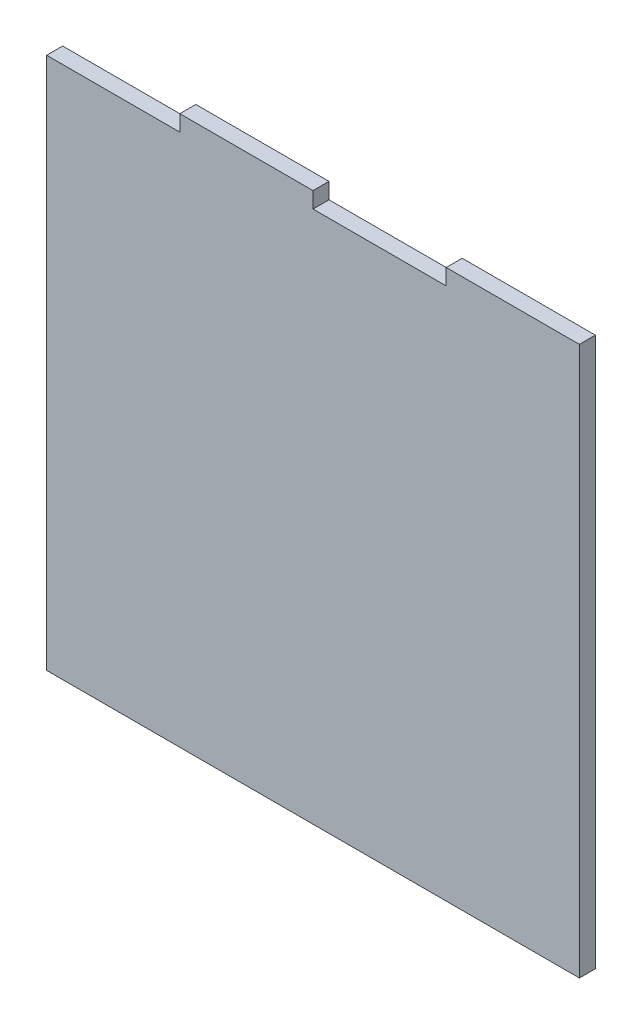
ISO-10303-21;
HEADER;
FILE_DESCRIPTION(('STEP AP214'),'2;1');
FILE_NAME('part.step','',(''),(''),'','','');
FILE_SCHEMA(('AUTOMOTIVE_DESIGN { 1 0 10303 214 1 1 1 1 }'));
ENDSEC;
DATA;
#1=APPLICATION_CONTEXT('core data for automotive mechanical design processes');
#2=APPLICATION_PROTOCOL_DEFINITION('international standard','automotive_design',2000,#1);
#3=PRODUCT_CONTEXT('',#1,'mechanical');
#4=PRODUCT('Part','Part','',(#3));
#5=PRODUCT_RELATED_PRODUCT_CATEGORY('part','',(#4));
#6=PRODUCT_DEFINITION_FORMATION('','',#4);
#7=PRODUCT_DEFINITION_CONTEXT('part definition',#1,'design');
#8=PRODUCT_DEFINITION('design','',#6,#7);
#9=PRODUCT_DEFINITION_SHAPE('','',#8);
#10=(LENGTH_UNIT() NAMED_UNIT(*) SI_UNIT(.MILLI.,.METRE.));
#11=(NAMED_UNIT(*) PLANE_ANGLE_UNIT() SI_UNIT($,.RADIAN.));
#12=(NAMED_UNIT(*) SI_UNIT($,.STERADIAN.) SOLID_ANGLE_UNIT());
#13=UNCERTAINTY_MEASURE_WITH_UNIT(LENGTH_MEASURE(1.E-05),#10,'distance_accuracy_value','');
#14=(GEOMETRIC_REPRESENTATION_CONTEXT(3) GLOBAL_UNCERTAINTY_ASSIGNED_CONTEXT((#13)) GLOBAL_UNIT_ASSIGNED_CONTEXT((#10,
#11,#12)) REPRESENTATION_CONTEXT('',''));
#15=CARTESIAN_POINT('',(0.,0.,0.));
#16=DIRECTION('',(0.,0.,1.));
#17=DIRECTION('',(1.,0.,0.));
#18=AXIS2_PLACEMENT_3D('',#15,#16,#17);
#19=CARTESIAN_POINT('',(0.,0.,6.));
#20=DIRECTION('',(1.,0.,0.));
#21=DIRECTION('',(0.,1.,0.));
#22=AXIS2_PLACEMENT_3D('',#19,#20,#21);
#23=PLANE('',#22);
#24=DIRECTION('',(0.,-1.,0.));
#25=VECTOR('',#24,1.);
#26=CARTESIAN_POINT('',(0.,0.,0.));
#27=LINE('',#26,#25);
#28=CARTESIAN_POINT('',(0.,0.,0.));
#29=VERTEX_POINT('',#28);
#30=CARTESIAN_POINT('',(0.,-200.,0.));
#31=VERTEX_POINT('',#30);
#32=EDGE_CURVE('E142',#29,#31,#27,.T.);
#33=ORIENTED_EDGE('',*,*,#32,.T.);
#34=DIRECTION('',(0.,0.,-1.));
#35=VECTOR('',#34,1.);
#36=CARTESIAN_POINT('',(0.,-200.,6.));
#37=LINE('',#36,#35);
#38=CARTESIAN_POINT('',(0.,-200.,6.));
#39=VERTEX_POINT('',#38);
#40=EDGE_CURVE('E11',#39,#31,#37,.T.);
#41=ORIENTED_EDGE('',*,*,#40,.F.);
#42=DIRECTION('',(0.,-1.,0.));
#43=VECTOR('',#42,1.);
#44=CARTESIAN_POINT('',(0.,0.,6.));
#45=LINE('',#44,#43);
#46=CARTESIAN_POINT('',(0.,0.,6.));
#47=VERTEX_POINT('',#46);
#48=EDGE_CURVE('E161',#47,#39,#45,.T.);
#49=ORIENTED_EDGE('',*,*,#48,.F.);
#50=DIRECTION('',(0.,0.,-1.));
#51=VECTOR('',#50,1.);
#52=CARTESIAN_POINT('',(0.,0.,6.));
#53=LINE('',#52,#51);
#54=EDGE_CURVE('E138',#47,#29,#53,.T.);
#55=ORIENTED_EDGE('',*,*,#54,.T.);
#56=EDGE_LOOP('',(#33,#41,#49,#55));
#57=FACE_BOUND('',#56,.T.);
#58=ADVANCED_FACE('F34',(#57),#23,.F.);
#59=CARTESIAN_POINT('',(0.,-200.,6.));
#60=DIRECTION('',(0.,1.,0.));
#61=DIRECTION('',(0.,0.,1.));
#62=AXIS2_PLACEMENT_3D('',#59,#60,#61);
#63=PLANE('',#62);
#64=DIRECTION('',(1.,0.,0.));
#65=VECTOR('',#64,1.);
#66=CARTESIAN_POINT('',(0.,-200.,0.));
#67=LINE('',#66,#65);
#68=CARTESIAN_POINT('',(200.,-200.,0.));
#69=VERTEX_POINT('',#68);
#70=EDGE_CURVE('E145',#31,#69,#67,.T.);
#71=ORIENTED_EDGE('',*,*,#70,.T.);
#72=DIRECTION('',(0.,0.,-1.));
#73=VECTOR('',#72,1.);
#74=CARTESIAN_POINT('',(200.,-200.,6.));
#75=LINE('',#74,#73);
#76=CARTESIAN_POINT('',(200.,-200.,6.));
#77=VERTEX_POINT('',#76);
#78=EDGE_CURVE('E42',#77,#69,#75,.T.);
#79=ORIENTED_EDGE('',*,*,#78,.F.);
#80=DIRECTION('',(1.,0.,0.));
#81=VECTOR('',#80,1.);
#82=CARTESIAN_POINT('',(0.,-200.,6.));
#83=LINE('',#82,#81);
#84=EDGE_CURVE('E99',#39,#77,#83,.T.);
#85=ORIENTED_EDGE('',*,*,#84,.F.);
#86=ORIENTED_EDGE('',*,*,#40,.T.);
#87=EDGE_LOOP('',(#71,#79,#85,#86));
#88=FACE_BOUND('',#87,.T.);
#89=ADVANCED_FACE('F182',(#88),#63,.F.);
#90=CARTESIAN_POINT('',(200.,6.,6.));
#91=DIRECTION('',(-1.,0.,0.));
#92=DIRECTION('',(0.,0.,1.));
#93=AXIS2_PLACEMENT_3D('',#90,#91,#92);
#94=PLANE('',#93);
#95=DIRECTION('',(0.,1.,0.));
#96=VECTOR('',#95,1.);
#97=CARTESIAN_POINT('',(200.,6.,0.));
#98=LINE('',#97,#96);
#99=CARTESIAN_POINT('',(200.,6.,0.));
#100=VERTEX_POINT('',#99);
#101=EDGE_CURVE('E148',#69,#100,#98,.T.);
#102=ORIENTED_EDGE('',*,*,#101,.T.);
#103=DIRECTION('',(0.,0.,-1.));
#104=VECTOR('',#103,1.);
#105=CARTESIAN_POINT('',(200.,6.,6.));
#106=LINE('',#105,#104);
#107=CARTESIAN_POINT('',(200.,6.,6.));
#108=VERTEX_POINT('',#107);
#109=EDGE_CURVE('E174',#108,#100,#106,.T.);
#110=ORIENTED_EDGE('',*,*,#109,.F.);
#111=DIRECTION('',(0.,1.,0.));
#112=VECTOR('',#111,1.);
#113=CARTESIAN_POINT('',(200.,0.,6.));
#114=LINE('',#113,#112);
#115=EDGE_CURVE('E181',#77,#108,#114,.T.);
#116=ORIENTED_EDGE('',*,*,#115,.F.);
#117=ORIENTED_EDGE('',*,*,#78,.T.);
#118=EDGE_LOOP('',(#102,#110,#116,#117));
#119=FACE_BOUND('',#118,.T.);
#120=ADVANCED_FACE('F179',(#119),#94,.F.);
#121=CARTESIAN_POINT('',(150.,6.,6.));
#122=DIRECTION('',(0.,-1.,0.));
#123=DIRECTION('',(0.,0.,-1.));
#124=AXIS2_PLACEMENT_3D('',#121,#122,#123);
#125=PLANE('',#124);
#126=DIRECTION('',(-1.,0.,0.));
#127=VECTOR('',#126,1.);
#128=CARTESIAN_POINT('',(150.,6.,0.));
#129=LINE('',#128,#127);
#130=CARTESIAN_POINT('',(150.,6.,0.));
#131=VERTEX_POINT('',#130);
#132=EDGE_CURVE('E150',#100,#131,#129,.T.);
#133=ORIENTED_EDGE('',*,*,#132,.T.);
#134=DIRECTION('',(0.,0.,-1.));
#135=VECTOR('',#134,1.);
#136=CARTESIAN_POINT('',(150.,6.,6.));
#137=LINE('',#136,#135);
#138=CARTESIAN_POINT('',(150.,6.,6.));
#139=VERTEX_POINT('',#138);
#140=EDGE_CURVE('E171',#139,#131,#137,.T.);
#141=ORIENTED_EDGE('',*,*,#140,.F.);
#142=DIRECTION('',(-1.,0.,0.));
#143=VECTOR('',#142,1.);
#144=CARTESIAN_POINT('',(150.,6.,6.));
#145=LINE('',#144,#143);
#146=EDGE_CURVE('E201',#108,#139,#145,.T.);
#147=ORIENTED_EDGE('',*,*,#146,.F.);
#148=ORIENTED_EDGE('',*,*,#109,.T.);
#149=EDGE_LOOP('',(#133,#141,#147,#148));
#150=FACE_BOUND('',#149,.T.);
#151=ADVANCED_FACE('F192',(#150),#125,.F.);
#152=CARTESIAN_POINT('',(150.,0.,6.));
#153=DIRECTION('',(1.,0.,0.));
#154=DIRECTION('',(0.,0.,-1.));
#155=AXIS2_PLACEMENT_3D('',#152,#153,#154);
#156=PLANE('',#155);
#157=DIRECTION('',(0.,-1.,0.));
#158=VECTOR('',#157,1.);
#159=CARTESIAN_POINT('',(150.,0.,0.));
#160=LINE('',#159,#158);
#161=CARTESIAN_POINT('',(150.,0.,0.));
#162=VERTEX_POINT('',#161);
#163=EDGE_CURVE('E152',#131,#162,#160,.T.);
#164=ORIENTED_EDGE('',*,*,#163,.T.);
#165=DIRECTION('',(0.,0.,-1.));
#166=VECTOR('',#165,1.);
#167=CARTESIAN_POINT('',(150.,0.,6.));
#168=LINE('',#167,#166);
#169=CARTESIAN_POINT('',(150.,0.,6.));
#170=VERTEX_POINT('',#169);
#171=EDGE_CURVE('E168',#170,#162,#168,.T.);
#172=ORIENTED_EDGE('',*,*,#171,.F.);
#173=DIRECTION('',(0.,-1.,0.));
#174=VECTOR('',#173,1.);
#175=CARTESIAN_POINT('',(150.,0.,6.));
#176=LINE('',#175,#174);
#177=EDGE_CURVE('E198',#139,#170,#176,.T.);
#178=ORIENTED_EDGE('',*,*,#177,.F.);
#179=ORIENTED_EDGE('',*,*,#140,.T.);
#180=EDGE_LOOP('',(#164,#172,#178,#179));
#181=FACE_BOUND('',#180,.T.);
#182=ADVANCED_FACE('F196',(#181),#156,.F.);
#183=CARTESIAN_POINT('',(100.,0.,6.));
#184=DIRECTION('',(0.,-1.,0.));
#185=DIRECTION('',(0.,0.,-1.));
#186=AXIS2_PLACEMENT_3D('',#183,#184,#185);
#187=PLANE('',#186);
#188=DIRECTION('',(-1.,0.,0.));
#189=VECTOR('',#188,1.);
#190=CARTESIAN_POINT('',(100.,0.,0.));
#191=LINE('',#190,#189);
#192=CARTESIAN_POINT('',(100.,0.,0.));
#193=VERTEX_POINT('',#192);
#194=EDGE_CURVE('E154',#162,#193,#191,.T.);
#195=ORIENTED_EDGE('',*,*,#194,.T.);
#196=DIRECTION('',(0.,0.,-1.));
#197=VECTOR('',#196,1.);
#198=CARTESIAN_POINT('',(100.,0.,6.));
#199=LINE('',#198,#197);
#200=CARTESIAN_POINT('',(100.,0.,6.));
#201=VERTEX_POINT('',#200);
#202=EDGE_CURVE('E165',#201,#193,#199,.T.);
#203=ORIENTED_EDGE('',*,*,#202,.F.);
#204=DIRECTION('',(-1.,0.,0.));
#205=VECTOR('',#204,1.);
#206=CARTESIAN_POINT('',(100.,0.,6.));
#207=LINE('',#206,#205);
#208=EDGE_CURVE('E200',#170,#201,#207,.T.);
#209=ORIENTED_EDGE('',*,*,#208,.F.);
#210=ORIENTED_EDGE('',*,*,#171,.T.);
#211=EDGE_LOOP('',(#195,#203,#209,#210));
#212=FACE_BOUND('',#211,.T.);
#213=ADVANCED_FACE('F216',(#212),#187,.F.);
#214=CARTESIAN_POINT('',(100.,6.,6.));
#215=DIRECTION('',(-1.,0.,0.));
#216=DIRECTION('',(0.,0.,1.));
#217=AXIS2_PLACEMENT_3D('',#214,#215,#216);
#218=PLANE('',#217);
#219=DIRECTION('',(0.,1.,0.));
#220=VECTOR('',#219,1.);
#221=CARTESIAN_POINT('',(100.,6.,0.));
#222=LINE('',#221,#220);
#223=CARTESIAN_POINT('',(100.,6.,0.));
#224=VERTEX_POINT('',#223);
#225=EDGE_CURVE('E156',#193,#224,#222,.T.);
#226=ORIENTED_EDGE('',*,*,#225,.T.);
#227=DIRECTION('',(0.,0.,-1.));
#228=VECTOR('',#227,1.);
#229=CARTESIAN_POINT('',(100.,6.,6.));
#230=LINE('',#229,#228);
#231=CARTESIAN_POINT('',(100.,6.,6.));
#232=VERTEX_POINT('',#231);
#233=EDGE_CURVE('E133',#232,#224,#230,.T.);
#234=ORIENTED_EDGE('',*,*,#233,.F.);
#235=DIRECTION('',(0.,1.,0.));
#236=VECTOR('',#235,1.);
#237=CARTESIAN_POINT('',(100.,6.,6.));
#238=LINE('',#237,#236);
#239=EDGE_CURVE('E124',#201,#232,#238,.T.);
#240=ORIENTED_EDGE('',*,*,#239,.F.);
#241=ORIENTED_EDGE('',*,*,#202,.T.);
#242=EDGE_LOOP('',(#226,#234,#240,#241));
#243=FACE_BOUND('',#242,.T.);
#244=ADVANCED_FACE('F213',(#243),#218,.F.);
#245=CARTESIAN_POINT('',(50.,6.,6.));
#246=DIRECTION('',(0.,-1.,0.));
#247=DIRECTION('',(0.,0.,-1.));
#248=AXIS2_PLACEMENT_3D('',#245,#246,#247);
#249=PLANE('',#248);
#250=DIRECTION('',(-1.,0.,0.));
#251=VECTOR('',#250,1.);
#252=CARTESIAN_POINT('',(50.,6.,0.));
#253=LINE('',#252,#251);
#254=CARTESIAN_POINT('',(50.,6.,0.));
#255=VERTEX_POINT('',#254);
#256=EDGE_CURVE('E132',#224,#255,#253,.T.);
#257=ORIENTED_EDGE('',*,*,#256,.T.);
#258=DIRECTION('',(0.,0.,-1.));
#259=VECTOR('',#258,1.);
#260=CARTESIAN_POINT('',(50.,6.,6.));
#261=LINE('',#260,#259);
#262=CARTESIAN_POINT('',(50.,6.,6.));
#263=VERTEX_POINT('',#262);
#264=EDGE_CURVE('E129',#263,#255,#261,.T.);
#265=ORIENTED_EDGE('',*,*,#264,.F.);
#266=DIRECTION('',(-1.,0.,0.));
#267=VECTOR('',#266,1.);
#268=CARTESIAN_POINT('',(50.,6.,6.));
#269=LINE('',#268,#267);
#270=EDGE_CURVE('E118',#232,#263,#269,.T.);
#271=ORIENTED_EDGE('',*,*,#270,.F.);
#272=ORIENTED_EDGE('',*,*,#233,.T.);
#273=EDGE_LOOP('',(#257,#265,#271,#272));
#274=FACE_BOUND('',#273,.T.);
#275=ADVANCED_FACE('F130',(#274),#249,.F.);
#276=CARTESIAN_POINT('',(50.,0.,6.));
#277=DIRECTION('',(1.,0.,0.));
#278=DIRECTION('',(0.,0.,-1.));
#279=AXIS2_PLACEMENT_3D('',#276,#277,#278);
#280=PLANE('',#279);
#281=DIRECTION('',(0.,-1.,0.));
#282=VECTOR('',#281,1.);
#283=CARTESIAN_POINT('',(50.,0.,0.));
#284=LINE('',#283,#282);
#285=CARTESIAN_POINT('',(50.,0.,0.));
#286=VERTEX_POINT('',#285);
#287=EDGE_CURVE('E85',#255,#286,#284,.T.);
#288=ORIENTED_EDGE('',*,*,#287,.T.);
#289=DIRECTION('',(0.,0.,-1.));
#290=VECTOR('',#289,1.);
#291=CARTESIAN_POINT('',(50.,0.,6.));
#292=LINE('',#291,#290);
#293=CARTESIAN_POINT('',(50.,0.,6.));
#294=VERTEX_POINT('',#293);
#295=EDGE_CURVE('E134',#294,#286,#292,.T.);
#296=ORIENTED_EDGE('',*,*,#295,.F.);
#297=DIRECTION('',(0.,-1.,0.));
#298=VECTOR('',#297,1.);
#299=CARTESIAN_POINT('',(50.,0.,6.));
#300=LINE('',#299,#298);
#301=EDGE_CURVE('E122',#263,#294,#300,.T.);
#302=ORIENTED_EDGE('',*,*,#301,.F.);
#303=ORIENTED_EDGE('',*,*,#264,.T.);
#304=EDGE_LOOP('',(#288,#296,#302,#303));
#305=FACE_BOUND('',#304,.T.);
#306=ADVANCED_FACE('F136',(#305),#280,.F.);
#307=CARTESIAN_POINT('',(0.,0.,6.));
#308=DIRECTION('',(0.,-1.,0.));
#309=DIRECTION('',(0.,0.,-1.));
#310=AXIS2_PLACEMENT_3D('',#307,#308,#309);
#311=PLANE('',#310);
#312=DIRECTION('',(-1.,0.,0.));
#313=VECTOR('',#312,1.);
#314=CARTESIAN_POINT('',(0.,0.,0.));
#315=LINE('',#314,#313);
#316=EDGE_CURVE('E91',#286,#29,#315,.T.);
#317=ORIENTED_EDGE('',*,*,#316,.T.);
#318=ORIENTED_EDGE('',*,*,#54,.F.);
#319=DIRECTION('',(-1.,0.,0.));
#320=VECTOR('',#319,1.);
#321=CARTESIAN_POINT('',(0.,0.,6.));
#322=LINE('',#321,#320);
#323=EDGE_CURVE('E50',#294,#47,#322,.T.);
#324=ORIENTED_EDGE('',*,*,#323,.F.);
#325=ORIENTED_EDGE('',*,*,#295,.T.);
#326=EDGE_LOOP('',(#317,#318,#324,#325));
#327=FACE_BOUND('',#326,.T.);
#328=ADVANCED_FACE('F210',(#327),#311,.F.);
#329=CARTESIAN_POINT('',(0.,0.,6.));
#330=DIRECTION('',(0.,0.,1.));
#331=DIRECTION('',(1.,0.,0.));
#332=AXIS2_PLACEMENT_3D('',#329,#330,#331);
#333=PLANE('',#332);
#334=ORIENTED_EDGE('',*,*,#48,.T.);
#335=ORIENTED_EDGE('',*,*,#84,.T.);
#336=ORIENTED_EDGE('',*,*,#115,.T.);
#337=ORIENTED_EDGE('',*,*,#146,.T.);
#338=ORIENTED_EDGE('',*,*,#177,.T.);
#339=ORIENTED_EDGE('',*,*,#208,.T.);
#340=ORIENTED_EDGE('',*,*,#239,.T.);
#341=ORIENTED_EDGE('',*,*,#270,.T.);
#342=ORIENTED_EDGE('',*,*,#301,.T.);
#343=ORIENTED_EDGE('',*,*,#323,.T.);
#344=EDGE_LOOP('',(#334,#335,#336,#337,#338,#339,#340,#341,#342,#343));
#345=FACE_BOUND('',#344,.T.);
#346=ADVANCED_FACE('F120',(#345),#333,.T.);
#347=CARTESIAN_POINT('',(0.,0.,0.));
#348=DIRECTION('',(0.,0.,1.));
#349=DIRECTION('',(1.,0.,0.));
#350=AXIS2_PLACEMENT_3D('',#347,#348,#349);
#351=PLANE('',#350);
#352=ORIENTED_EDGE('',*,*,#32,.F.);
#353=ORIENTED_EDGE('',*,*,#316,.F.);
#354=ORIENTED_EDGE('',*,*,#287,.F.);
#355=ORIENTED_EDGE('',*,*,#256,.F.);
#356=ORIENTED_EDGE('',*,*,#225,.F.);
#357=ORIENTED_EDGE('',*,*,#194,.F.);
#358=ORIENTED_EDGE('',*,*,#163,.F.);
#359=ORIENTED_EDGE('',*,*,#132,.F.);
#360=ORIENTED_EDGE('',*,*,#101,.F.);
#361=ORIENTED_EDGE('',*,*,#70,.F.);
#362=EDGE_LOOP('',(#352,#353,#354,#355,#356,#357,#358,#359,#360,#361));
#363=FACE_BOUND('',#362,.T.);
#364=ADVANCED_FACE('F186',(#363),#351,.F.);
#365=CLOSED_SHELL('',(#58,#89,#120,#151,#182,#213,#244,#275,#306,#328,#346,#364));
#366=MANIFOLD_SOLID_BREP('B2',#365);
#367=ADVANCED_BREP_SHAPE_REPRESENTATION('',(#18,#366),#14);
#368=SHAPE_DEFINITION_REPRESENTATION(#9,#367);
ENDSEC;
END-ISO-10303-21;
